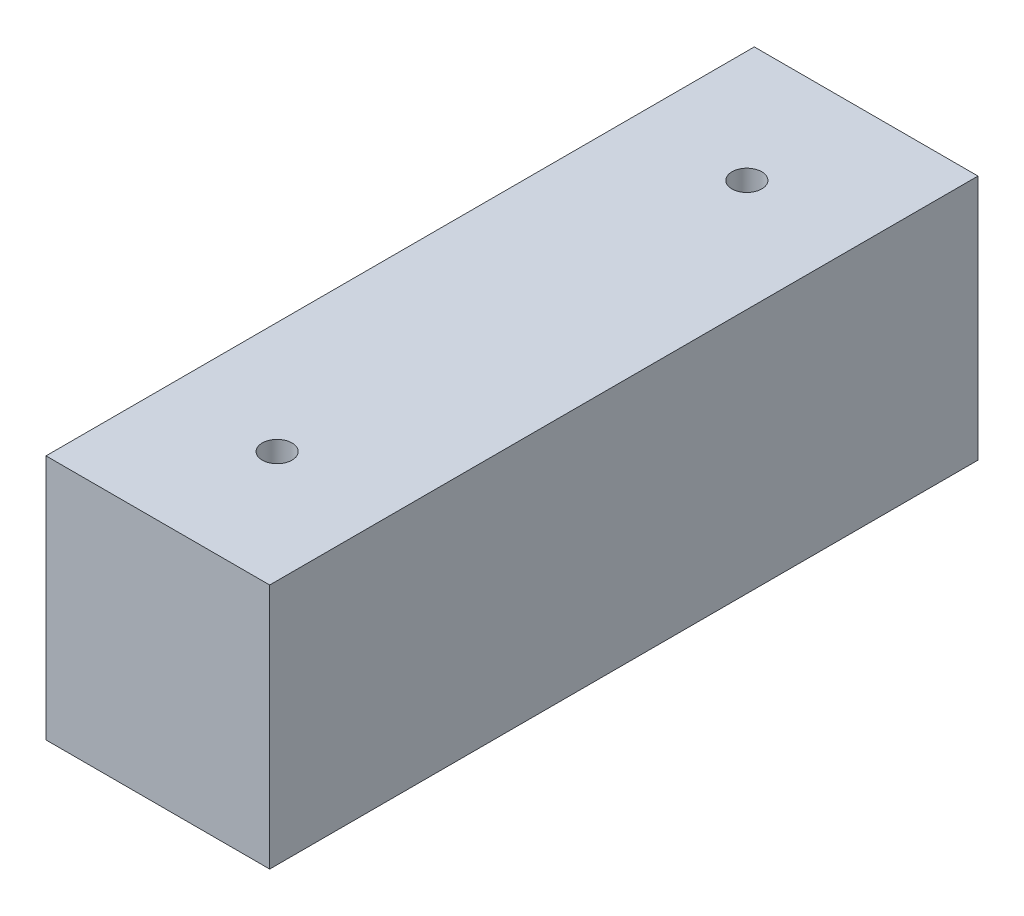
ISO-10303-21;
HEADER;
FILE_DESCRIPTION(('STEP AP214'),'2;1');
FILE_NAME('part.step','',(''),(''),'','','');
FILE_SCHEMA(('AUTOMOTIVE_DESIGN { 1 0 10303 214 1 1 1 1 }'));
ENDSEC;
DATA;
#1=APPLICATION_CONTEXT('core data for automotive mechanical design processes');
#2=APPLICATION_PROTOCOL_DEFINITION('international standard','automotive_design',2000,#1);
#3=PRODUCT_CONTEXT('',#1,'mechanical');
#4=PRODUCT('Part','Part','',(#3));
#5=PRODUCT_RELATED_PRODUCT_CATEGORY('part','',(#4));
#6=PRODUCT_DEFINITION_FORMATION('','',#4);
#7=PRODUCT_DEFINITION_CONTEXT('part definition',#1,'design');
#8=PRODUCT_DEFINITION('design','',#6,#7);
#9=PRODUCT_DEFINITION_SHAPE('','',#8);
#10=(LENGTH_UNIT() NAMED_UNIT(*) SI_UNIT(.MILLI.,.METRE.));
#11=(NAMED_UNIT(*) PLANE_ANGLE_UNIT() SI_UNIT($,.RADIAN.));
#12=(NAMED_UNIT(*) SI_UNIT($,.STERADIAN.) SOLID_ANGLE_UNIT());
#13=UNCERTAINTY_MEASURE_WITH_UNIT(LENGTH_MEASURE(1.E-05),#10,'distance_accuracy_value','');
#14=(GEOMETRIC_REPRESENTATION_CONTEXT(3) GLOBAL_UNCERTAINTY_ASSIGNED_CONTEXT((#13)) GLOBAL_UNIT_ASSIGNED_CONTEXT((#10,
#11,#12)) REPRESENTATION_CONTEXT('',''));
#15=CARTESIAN_POINT('',(0.,0.,0.));
#16=DIRECTION('',(0.,0.,1.));
#17=DIRECTION('',(1.,0.,0.));
#18=AXIS2_PLACEMENT_3D('',#15,#16,#17);
#19=CARTESIAN_POINT('',(-15.,-16.5,-95.));
#20=DIRECTION('',(-1.,0.,0.));
#21=DIRECTION('',(0.,0.,1.));
#22=AXIS2_PLACEMENT_3D('',#19,#20,#21);
#23=PLANE('',#22);
#24=DIRECTION('',(0.,-1.,0.));
#25=VECTOR('',#24,1.);
#26=CARTESIAN_POINT('',(-15.,-16.5,0.));
#27=LINE('',#26,#25);
#28=CARTESIAN_POINT('',(-15.,16.5,0.));
#29=VERTEX_POINT('',#28);
#30=CARTESIAN_POINT('',(-15.,-16.5,0.));
#31=VERTEX_POINT('',#30);
#32=EDGE_CURVE('E97',#29,#31,#27,.T.);
#33=ORIENTED_EDGE('',*,*,#32,.F.);
#34=DIRECTION('',(0.,0.,1.));
#35=VECTOR('',#34,1.);
#36=CARTESIAN_POINT('',(-15.,16.5,-95.));
#37=LINE('',#36,#35);
#38=CARTESIAN_POINT('',(-15.,16.5,-95.));
#39=VERTEX_POINT('',#38);
#40=EDGE_CURVE('E11',#39,#29,#37,.T.);
#41=ORIENTED_EDGE('',*,*,#40,.F.);
#42=DIRECTION('',(0.,-1.,0.));
#43=VECTOR('',#42,1.);
#44=CARTESIAN_POINT('',(-15.,-16.5,-95.));
#45=LINE('',#44,#43);
#46=CARTESIAN_POINT('',(-15.,-16.5,-95.));
#47=VERTEX_POINT('',#46);
#48=EDGE_CURVE('E90',#39,#47,#45,.T.);
#49=ORIENTED_EDGE('',*,*,#48,.T.);
#50=DIRECTION('',(0.,0.,1.));
#51=VECTOR('',#50,1.);
#52=CARTESIAN_POINT('',(-15.,-16.5,-95.));
#53=LINE('',#52,#51);
#54=EDGE_CURVE('E35',#47,#31,#53,.T.);
#55=ORIENTED_EDGE('',*,*,#54,.T.);
#56=EDGE_LOOP('',(#33,#41,#49,#55));
#57=FACE_BOUND('',#56,.T.);
#58=ADVANCED_FACE('F32',(#57),#23,.T.);
#59=CARTESIAN_POINT('',(15.,16.5,-95.));
#60=DIRECTION('',(0.,1.,0.));
#61=DIRECTION('',(-1.,0.,0.));
#62=AXIS2_PLACEMENT_3D('',#59,#60,#61);
#63=PLANE('',#62);
#64=CARTESIAN_POINT('',(0.,16.5,-79.));
#65=DIRECTION('',(0.,1.,0.));
#66=DIRECTION('',(1.,0.,0.));
#67=AXIS2_PLACEMENT_3D('',#64,#65,#66);
#68=CIRCLE('',#67,2.);
#69=CARTESIAN_POINT('',(1.99999999999999,16.5,-79.));
#70=VERTEX_POINT('',#69);
#71=EDGE_CURVE('E150',#70,#70,#68,.T.);
#72=ORIENTED_EDGE('',*,*,#71,.F.);
#73=EDGE_LOOP('',(#72));
#74=FACE_BOUND('',#73,.T.);
#75=CARTESIAN_POINT('',(0.,16.5,-16.));
#76=DIRECTION('',(0.,1.,0.));
#77=DIRECTION('',(-1.,0.,0.));
#78=AXIS2_PLACEMENT_3D('',#75,#76,#77);
#79=CIRCLE('',#78,2.);
#80=CARTESIAN_POINT('',(-2.00000000000001,16.5,-16.));
#81=VERTEX_POINT('',#80);
#82=EDGE_CURVE('E149',#81,#81,#79,.T.);
#83=ORIENTED_EDGE('',*,*,#82,.F.);
#84=EDGE_LOOP('',(#83));
#85=FACE_BOUND('',#84,.T.);
#86=DIRECTION('',(-1.,0.,0.));
#87=VECTOR('',#86,1.);
#88=CARTESIAN_POINT('',(15.,16.5,0.));
#89=LINE('',#88,#87);
#90=CARTESIAN_POINT('',(15.,16.5,0.));
#91=VERTEX_POINT('',#90);
#92=EDGE_CURVE('E92',#91,#29,#89,.T.);
#93=ORIENTED_EDGE('',*,*,#92,.F.);
#94=DIRECTION('',(0.,0.,1.));
#95=VECTOR('',#94,1.);
#96=CARTESIAN_POINT('',(15.,16.5,-95.));
#97=LINE('',#96,#95);
#98=CARTESIAN_POINT('',(15.,16.5,-95.));
#99=VERTEX_POINT('',#98);
#100=EDGE_CURVE('E41',#99,#91,#97,.T.);
#101=ORIENTED_EDGE('',*,*,#100,.F.);
#102=DIRECTION('',(-1.,0.,0.));
#103=VECTOR('',#102,1.);
#104=CARTESIAN_POINT('',(15.,16.5,-95.));
#105=LINE('',#104,#103);
#106=EDGE_CURVE('E87',#99,#39,#105,.T.);
#107=ORIENTED_EDGE('',*,*,#106,.T.);
#108=ORIENTED_EDGE('',*,*,#40,.T.);
#109=EDGE_LOOP('',(#93,#101,#107,#108));
#110=FACE_BOUND('',#109,.T.);
#111=ADVANCED_FACE('F108',(#74,#85,#110),#63,.T.);
#112=CARTESIAN_POINT('',(15.,-16.5,-95.));
#113=DIRECTION('',(1.,0.,0.));
#114=DIRECTION('',(0.,0.,-1.));
#115=AXIS2_PLACEMENT_3D('',#112,#113,#114);
#116=PLANE('',#115);
#117=DIRECTION('',(0.,1.,0.));
#118=VECTOR('',#117,1.);
#119=CARTESIAN_POINT('',(15.,-16.5,0.));
#120=LINE('',#119,#118);
#121=CARTESIAN_POINT('',(15.,-16.5,0.));
#122=VERTEX_POINT('',#121);
#123=EDGE_CURVE('E82',#122,#91,#120,.T.);
#124=ORIENTED_EDGE('',*,*,#123,.F.);
#125=DIRECTION('',(0.,0.,1.));
#126=VECTOR('',#125,1.);
#127=CARTESIAN_POINT('',(15.,-16.5,-95.));
#128=LINE('',#127,#126);
#129=CARTESIAN_POINT('',(15.,-16.5,-95.));
#130=VERTEX_POINT('',#129);
#131=EDGE_CURVE('E77',#130,#122,#128,.T.);
#132=ORIENTED_EDGE('',*,*,#131,.F.);
#133=DIRECTION('',(0.,1.,0.));
#134=VECTOR('',#133,1.);
#135=CARTESIAN_POINT('',(15.,-16.5,-95.));
#136=LINE('',#135,#134);
#137=EDGE_CURVE('E80',#130,#99,#136,.T.);
#138=ORIENTED_EDGE('',*,*,#137,.T.);
#139=ORIENTED_EDGE('',*,*,#100,.T.);
#140=EDGE_LOOP('',(#124,#132,#138,#139));
#141=FACE_BOUND('',#140,.T.);
#142=ADVANCED_FACE('F79',(#141),#116,.T.);
#143=CARTESIAN_POINT('',(15.,-16.5,-95.));
#144=DIRECTION('',(0.,-1.,0.));
#145=DIRECTION('',(1.,0.,0.));
#146=AXIS2_PLACEMENT_3D('',#143,#144,#145);
#147=PLANE('',#146);
#148=DIRECTION('',(1.,0.,0.));
#149=VECTOR('',#148,1.);
#150=CARTESIAN_POINT('',(15.,-16.5,0.));
#151=LINE('',#150,#149);
#152=EDGE_CURVE('E100',#31,#122,#151,.T.);
#153=ORIENTED_EDGE('',*,*,#152,.F.);
#154=ORIENTED_EDGE('',*,*,#54,.F.);
#155=DIRECTION('',(1.,0.,0.));
#156=VECTOR('',#155,1.);
#157=CARTESIAN_POINT('',(15.,-16.5,-95.));
#158=LINE('',#157,#156);
#159=EDGE_CURVE('E86',#47,#130,#158,.T.);
#160=ORIENTED_EDGE('',*,*,#159,.T.);
#161=ORIENTED_EDGE('',*,*,#131,.T.);
#162=EDGE_LOOP('',(#153,#154,#160,#161));
#163=FACE_BOUND('',#162,.T.);
#164=ADVANCED_FACE('F89',(#163),#147,.T.);
#165=CARTESIAN_POINT('',(0.,0.,-95.));
#166=DIRECTION('',(0.,0.,1.));
#167=DIRECTION('',(1.,0.,0.));
#168=AXIS2_PLACEMENT_3D('',#165,#166,#167);
#169=PLANE('',#168);
#170=ORIENTED_EDGE('',*,*,#48,.F.);
#171=ORIENTED_EDGE('',*,*,#106,.F.);
#172=ORIENTED_EDGE('',*,*,#137,.F.);
#173=ORIENTED_EDGE('',*,*,#159,.F.);
#174=EDGE_LOOP('',(#170,#171,#172,#173));
#175=FACE_BOUND('',#174,.T.);
#176=ADVANCED_FACE('F85',(#175),#169,.F.);
#177=CARTESIAN_POINT('',(0.,0.,0.));
#178=DIRECTION('',(0.,0.,1.));
#179=DIRECTION('',(1.,0.,0.));
#180=AXIS2_PLACEMENT_3D('',#177,#178,#179);
#181=PLANE('',#180);
#182=ORIENTED_EDGE('',*,*,#32,.T.);
#183=ORIENTED_EDGE('',*,*,#152,.T.);
#184=ORIENTED_EDGE('',*,*,#123,.T.);
#185=ORIENTED_EDGE('',*,*,#92,.T.);
#186=EDGE_LOOP('',(#182,#183,#184,#185));
#187=FACE_BOUND('',#186,.T.);
#188=ADVANCED_FACE('F107',(#187),#181,.T.);
#189=CARTESIAN_POINT('',(0.,11.5,-16.));
#190=DIRECTION('',(0.,1.,0.));
#191=DIRECTION('',(-1.,0.,0.));
#192=AXIS2_PLACEMENT_3D('',#189,#190,#191);
#193=CYLINDRICAL_SURFACE('',#192,2.);
#194=CARTESIAN_POINT('',(0.,11.5,-16.));
#195=DIRECTION('',(0.,1.,0.));
#196=DIRECTION('',(-1.,0.,0.));
#197=AXIS2_PLACEMENT_3D('',#194,#195,#196);
#198=CIRCLE('',#197,2.);
#199=CARTESIAN_POINT('',(-2.,11.5,-16.));
#200=VERTEX_POINT('',#199);
#201=EDGE_CURVE('E101',#200,#200,#198,.T.);
#202=ORIENTED_EDGE('',*,*,#201,.F.);
#203=EDGE_LOOP('',(#202));
#204=FACE_BOUND('',#203,.T.);
#205=ORIENTED_EDGE('',*,*,#82,.T.);
#206=EDGE_LOOP('',(#205));
#207=FACE_BOUND('',#206,.T.);
#208=ADVANCED_FACE('F128',(#204,#207),#193,.F.);
#209=CARTESIAN_POINT('',(0.,11.5,-16.));
#210=DIRECTION('',(0.,1.,0.));
#211=DIRECTION('',(-1.,0.,0.));
#212=AXIS2_PLACEMENT_3D('',#209,#210,#211);
#213=PLANE('',#212);
#214=ORIENTED_EDGE('',*,*,#201,.T.);
#215=EDGE_LOOP('',(#214));
#216=FACE_BOUND('',#215,.T.);
#217=ADVANCED_FACE('F132',(#216),#213,.T.);
#218=CARTESIAN_POINT('',(0.,11.5,-79.));
#219=DIRECTION('',(0.,1.,0.));
#220=DIRECTION('',(-1.,0.,0.));
#221=AXIS2_PLACEMENT_3D('',#218,#219,#220);
#222=CYLINDRICAL_SURFACE('',#221,2.);
#223=CARTESIAN_POINT('',(0.,11.5,-79.));
#224=DIRECTION('',(0.,1.,0.));
#225=DIRECTION('',(1.,0.,0.));
#226=AXIS2_PLACEMENT_3D('',#223,#224,#225);
#227=CIRCLE('',#226,2.);
#228=CARTESIAN_POINT('',(2.,11.5,-79.));
#229=VERTEX_POINT('',#228);
#230=EDGE_CURVE('E148',#229,#229,#227,.T.);
#231=ORIENTED_EDGE('',*,*,#230,.F.);
#232=EDGE_LOOP('',(#231));
#233=FACE_BOUND('',#232,.T.);
#234=ORIENTED_EDGE('',*,*,#71,.T.);
#235=EDGE_LOOP('',(#234));
#236=FACE_BOUND('',#235,.T.);
#237=ADVANCED_FACE('F136',(#233,#236),#222,.F.);
#238=CARTESIAN_POINT('',(0.,11.5,-79.));
#239=DIRECTION('',(0.,-1.,0.));
#240=DIRECTION('',(1.,0.,0.));
#241=AXIS2_PLACEMENT_3D('',#238,#239,#240);
#242=PLANE('',#241);
#243=ORIENTED_EDGE('',*,*,#230,.T.);
#244=EDGE_LOOP('',(#243));
#245=FACE_BOUND('',#244,.T.);
#246=ADVANCED_FACE('F140',(#245),#242,.F.);
#247=CLOSED_SHELL('',(#58,#111,#142,#164,#176,#188,#208,#217,#237,#246));
#248=MANIFOLD_SOLID_BREP('B2',#247);
#249=ADVANCED_BREP_SHAPE_REPRESENTATION('',(#18,#248),#14);
#250=SHAPE_DEFINITION_REPRESENTATION(#9,#249);
ENDSEC;
END-ISO-10303-21;
